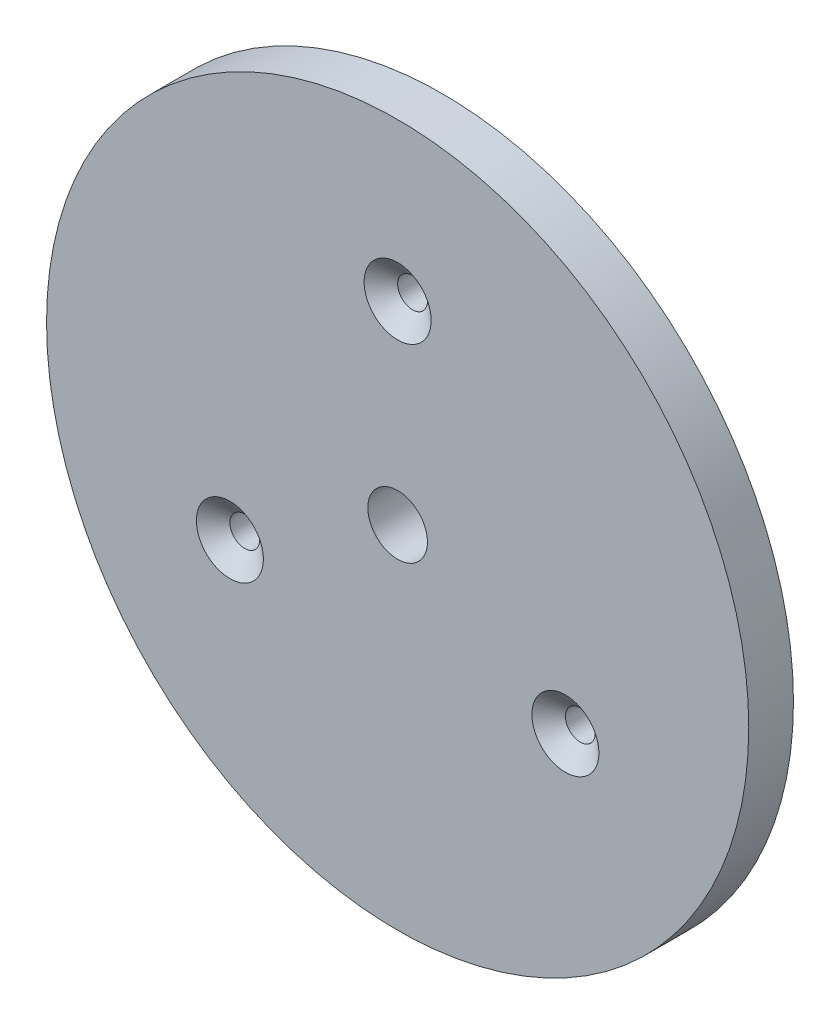
ISO-10303-21;
HEADER;
FILE_DESCRIPTION(('STEP AP214'),'2;1');
FILE_NAME('part.step','',(''),(''),'','','');
FILE_SCHEMA(('AUTOMOTIVE_DESIGN { 1 0 10303 214 1 1 1 1 }'));
ENDSEC;
DATA;
#1=APPLICATION_CONTEXT('core data for automotive mechanical design processes');
#2=APPLICATION_PROTOCOL_DEFINITION('international standard','automotive_design',2000,#1);
#3=PRODUCT_CONTEXT('',#1,'mechanical');
#4=PRODUCT('Part','Part','',(#3));
#5=PRODUCT_RELATED_PRODUCT_CATEGORY('part','',(#4));
#6=PRODUCT_DEFINITION_FORMATION('','',#4);
#7=PRODUCT_DEFINITION_CONTEXT('part definition',#1,'design');
#8=PRODUCT_DEFINITION('design','',#6,#7);
#9=PRODUCT_DEFINITION_SHAPE('','',#8);
#10=(LENGTH_UNIT() NAMED_UNIT(*) SI_UNIT(.MILLI.,.METRE.));
#11=(NAMED_UNIT(*) PLANE_ANGLE_UNIT() SI_UNIT($,.RADIAN.));
#12=(NAMED_UNIT(*) SI_UNIT($,.STERADIAN.) SOLID_ANGLE_UNIT());
#13=UNCERTAINTY_MEASURE_WITH_UNIT(LENGTH_MEASURE(1.E-05),#10,'distance_accuracy_value','');
#14=(GEOMETRIC_REPRESENTATION_CONTEXT(3) GLOBAL_UNCERTAINTY_ASSIGNED_CONTEXT((#13)) GLOBAL_UNIT_ASSIGNED_CONTEXT((#10,
#11,#12)) REPRESENTATION_CONTEXT('',''));
#15=CARTESIAN_POINT('',(0.,0.,0.));
#16=DIRECTION('',(0.,0.,1.));
#17=DIRECTION('',(1.,0.,0.));
#18=AXIS2_PLACEMENT_3D('',#15,#16,#17);
#19=CARTESIAN_POINT('',(0.,0.,6.));
#20=DIRECTION('',(0.,0.,1.));
#21=DIRECTION('',(1.,0.,0.));
#22=AXIS2_PLACEMENT_3D('',#19,#20,#21);
#23=PLANE('',#22);
#24=CARTESIAN_POINT('',(22.5166604983954,-13.,6.));
#25=DIRECTION('',(0.,0.,1.));
#26=DIRECTION('',(1.,0.,0.));
#27=AXIS2_PLACEMENT_3D('',#24,#25,#26);
#28=CIRCLE('',#27,4.5);
#29=CARTESIAN_POINT('',(27.0166604983954,-13.,6.));
#30=VERTEX_POINT('',#29);
#31=EDGE_CURVE('E52',#30,#30,#28,.F.);
#32=ORIENTED_EDGE('',*,*,#31,.T.);
#33=EDGE_LOOP('',(#32));
#34=FACE_BOUND('',#33,.T.);
#35=CARTESIAN_POINT('',(0.,26.,6.));
#36=DIRECTION('',(0.,0.,1.));
#37=DIRECTION('',(1.,0.,0.));
#38=AXIS2_PLACEMENT_3D('',#35,#36,#37);
#39=CIRCLE('',#38,4.50000000000003);
#40=CARTESIAN_POINT('',(4.50000000000003,26.,6.));
#41=VERTEX_POINT('',#40);
#42=EDGE_CURVE('E56',#41,#41,#39,.F.);
#43=ORIENTED_EDGE('',*,*,#42,.T.);
#44=EDGE_LOOP('',(#43));
#45=FACE_BOUND('',#44,.T.);
#46=CARTESIAN_POINT('',(-22.5166604983954,-13.,6.));
#47=DIRECTION('',(0.,0.,1.));
#48=DIRECTION('',(1.,0.,0.));
#49=AXIS2_PLACEMENT_3D('',#46,#47,#48);
#50=CIRCLE('',#49,4.50000000000005);
#51=CARTESIAN_POINT('',(-18.0166604983954,-13.,6.));
#52=VERTEX_POINT('',#51);
#53=EDGE_CURVE('E61',#52,#52,#50,.F.);
#54=ORIENTED_EDGE('',*,*,#53,.T.);
#55=EDGE_LOOP('',(#54));
#56=FACE_BOUND('',#55,.T.);
#57=CARTESIAN_POINT('',(0.,0.,6.));
#58=DIRECTION('',(0.,0.,1.));
#59=DIRECTION('',(1.,0.,0.));
#60=AXIS2_PLACEMENT_3D('',#57,#58,#59);
#61=CIRCLE('',#60,4.);
#62=CARTESIAN_POINT('',(4.,0.,6.));
#63=VERTEX_POINT('',#62);
#64=EDGE_CURVE('E71',#63,#63,#61,.T.);
#65=ORIENTED_EDGE('',*,*,#64,.F.);
#66=EDGE_LOOP('',(#65));
#67=FACE_BOUND('',#66,.T.);
#68=CARTESIAN_POINT('',(0.,0.,6.));
#69=DIRECTION('',(0.,0.,1.));
#70=DIRECTION('',(1.,0.,0.));
#71=AXIS2_PLACEMENT_3D('',#68,#69,#70);
#72=CIRCLE('',#71,47.125);
#73=CARTESIAN_POINT('',(47.125,0.,6.));
#74=VERTEX_POINT('',#73);
#75=EDGE_CURVE('E67',#74,#74,#72,.T.);
#76=ORIENTED_EDGE('',*,*,#75,.T.);
#77=EDGE_LOOP('',(#76));
#78=FACE_BOUND('',#77,.T.);
#79=ADVANCED_FACE('F40',(#34,#45,#56,#67,#78),#23,.T.);
#80=CARTESIAN_POINT('',(0.,0.,0.));
#81=DIRECTION('',(0.,0.,1.));
#82=DIRECTION('',(1.,0.,0.));
#83=AXIS2_PLACEMENT_3D('',#80,#81,#82);
#84=PLANE('',#83);
#85=CARTESIAN_POINT('',(0.,0.,0.));
#86=DIRECTION('',(0.,0.,1.));
#87=DIRECTION('',(1.,0.,0.));
#88=AXIS2_PLACEMENT_3D('',#85,#86,#87);
#89=CIRCLE('',#88,47.125);
#90=CARTESIAN_POINT('',(47.125,0.,0.));
#91=VERTEX_POINT('',#90);
#92=EDGE_CURVE('E68',#91,#91,#89,.T.);
#93=ORIENTED_EDGE('',*,*,#92,.F.);
#94=EDGE_LOOP('',(#93));
#95=FACE_BOUND('',#94,.T.);
#96=CARTESIAN_POINT('',(0.,0.,0.));
#97=DIRECTION('',(0.,0.,1.));
#98=DIRECTION('',(1.,0.,0.));
#99=AXIS2_PLACEMENT_3D('',#96,#97,#98);
#100=CIRCLE('',#99,4.);
#101=CARTESIAN_POINT('',(4.,0.,0.));
#102=VERTEX_POINT('',#101);
#103=EDGE_CURVE('E74',#102,#102,#100,.T.);
#104=ORIENTED_EDGE('',*,*,#103,.T.);
#105=EDGE_LOOP('',(#104));
#106=FACE_BOUND('',#105,.T.);
#107=CARTESIAN_POINT('',(0.,26.,0.));
#108=DIRECTION('',(0.,0.,1.));
#109=DIRECTION('',(1.,0.,0.));
#110=AXIS2_PLACEMENT_3D('',#107,#108,#109);
#111=CIRCLE('',#110,2.);
#112=CARTESIAN_POINT('',(2.,26.,0.));
#113=VERTEX_POINT('',#112);
#114=EDGE_CURVE('E77',#113,#113,#111,.T.);
#115=ORIENTED_EDGE('',*,*,#114,.T.);
#116=EDGE_LOOP('',(#115));
#117=FACE_BOUND('',#116,.T.);
#118=CARTESIAN_POINT('',(22.5166604983954,-13.,0.));
#119=DIRECTION('',(0.,0.,1.));
#120=DIRECTION('',(1.,0.,0.));
#121=AXIS2_PLACEMENT_3D('',#118,#119,#120);
#122=CIRCLE('',#121,2.);
#123=CARTESIAN_POINT('',(24.5166604983954,-13.,0.));
#124=VERTEX_POINT('',#123);
#125=EDGE_CURVE('E82',#124,#124,#122,.T.);
#126=ORIENTED_EDGE('',*,*,#125,.T.);
#127=EDGE_LOOP('',(#126));
#128=FACE_BOUND('',#127,.T.);
#129=CARTESIAN_POINT('',(-22.5166604983954,-13.,0.));
#130=DIRECTION('',(0.,0.,1.));
#131=DIRECTION('',(1.,0.,0.));
#132=AXIS2_PLACEMENT_3D('',#129,#130,#131);
#133=CIRCLE('',#132,2.);
#134=CARTESIAN_POINT('',(-20.5166604983954,-13.,0.));
#135=VERTEX_POINT('',#134);
#136=EDGE_CURVE('E85',#135,#135,#133,.T.);
#137=ORIENTED_EDGE('',*,*,#136,.T.);
#138=EDGE_LOOP('',(#137));
#139=FACE_BOUND('',#138,.T.);
#140=ADVANCED_FACE('F89',(#95,#106,#117,#128,#139),#84,.F.);
#141=CARTESIAN_POINT('',(0.,0.,6.));
#142=DIRECTION('',(0.,0.,-1.));
#143=DIRECTION('',(-1.,0.,0.));
#144=AXIS2_PLACEMENT_3D('',#141,#142,#143);
#145=CYLINDRICAL_SURFACE('',#144,47.125);
#146=ORIENTED_EDGE('',*,*,#75,.F.);
#147=EDGE_LOOP('',(#146));
#148=FACE_BOUND('',#147,.T.);
#149=ORIENTED_EDGE('',*,*,#92,.T.);
#150=EDGE_LOOP('',(#149));
#151=FACE_BOUND('',#150,.T.);
#152=ADVANCED_FACE('F114',(#148,#151),#145,.T.);
#153=CARTESIAN_POINT('',(0.,0.,6.));
#154=DIRECTION('',(0.,0.,-1.));
#155=DIRECTION('',(-1.,0.,0.));
#156=AXIS2_PLACEMENT_3D('',#153,#154,#155);
#157=CYLINDRICAL_SURFACE('',#156,4.);
#158=ORIENTED_EDGE('',*,*,#64,.T.);
#159=EDGE_LOOP('',(#158));
#160=FACE_BOUND('',#159,.T.);
#161=ORIENTED_EDGE('',*,*,#103,.F.);
#162=EDGE_LOOP('',(#161));
#163=FACE_BOUND('',#162,.T.);
#164=ADVANCED_FACE('F119',(#160,#163),#157,.F.);
#165=CARTESIAN_POINT('',(0.,26.,6.));
#166=DIRECTION('',(0.,0.,-1.));
#167=DIRECTION('',(-1.,0.,0.));
#168=AXIS2_PLACEMENT_3D('',#165,#166,#167);
#169=CYLINDRICAL_SURFACE('',#168,2.);
#170=CARTESIAN_POINT('',(0.,26.,3.99999999999998));
#171=DIRECTION('',(0.,0.,1.));
#172=DIRECTION('',(1.,0.,0.));
#173=AXIS2_PLACEMENT_3D('',#170,#171,#172);
#174=CIRCLE('',#173,2.);
#175=CARTESIAN_POINT('',(2.,26.,3.99999999999998));
#176=VERTEX_POINT('',#175);
#177=EDGE_CURVE('E48',#176,#176,#174,.T.);
#178=ORIENTED_EDGE('',*,*,#177,.T.);
#179=EDGE_LOOP('',(#178));
#180=FACE_BOUND('',#179,.T.);
#181=ORIENTED_EDGE('',*,*,#114,.F.);
#182=EDGE_LOOP('',(#181));
#183=FACE_BOUND('',#182,.T.);
#184=ADVANCED_FACE('F103',(#180,#183),#169,.F.);
#185=CARTESIAN_POINT('',(22.5166604983954,-13.,6.));
#186=DIRECTION('',(0.,0.,-1.));
#187=DIRECTION('',(-1.,0.,0.));
#188=AXIS2_PLACEMENT_3D('',#185,#186,#187);
#189=CYLINDRICAL_SURFACE('',#188,2.);
#190=CARTESIAN_POINT('',(22.5166604983954,-13.,3.99999999999999));
#191=DIRECTION('',(0.,0.,1.));
#192=DIRECTION('',(1.,0.,0.));
#193=AXIS2_PLACEMENT_3D('',#190,#191,#192);
#194=CIRCLE('',#193,2.);
#195=CARTESIAN_POINT('',(24.5166604983954,-13.,3.99999999999999));
#196=VERTEX_POINT('',#195);
#197=EDGE_CURVE('E64',#196,#196,#194,.T.);
#198=ORIENTED_EDGE('',*,*,#197,.T.);
#199=EDGE_LOOP('',(#198));
#200=FACE_BOUND('',#199,.T.);
#201=ORIENTED_EDGE('',*,*,#125,.F.);
#202=EDGE_LOOP('',(#201));
#203=FACE_BOUND('',#202,.T.);
#204=ADVANCED_FACE('F94',(#200,#203),#189,.F.);
#205=CARTESIAN_POINT('',(-22.5166604983954,-13.,6.));
#206=DIRECTION('',(0.,0.,-1.));
#207=DIRECTION('',(-1.,0.,0.));
#208=AXIS2_PLACEMENT_3D('',#205,#206,#207);
#209=CYLINDRICAL_SURFACE('',#208,2.);
#210=CARTESIAN_POINT('',(-22.5166604983954,-13.,3.99999999999997));
#211=DIRECTION('',(0.,0.,1.));
#212=DIRECTION('',(1.,0.,0.));
#213=AXIS2_PLACEMENT_3D('',#210,#211,#212);
#214=CIRCLE('',#213,2.);
#215=CARTESIAN_POINT('',(-20.5166604983954,-13.,3.99999999999997));
#216=VERTEX_POINT('',#215);
#217=EDGE_CURVE('E10',#216,#216,#214,.T.);
#218=ORIENTED_EDGE('',*,*,#217,.T.);
#219=EDGE_LOOP('',(#218));
#220=FACE_BOUND('',#219,.T.);
#221=ORIENTED_EDGE('',*,*,#136,.F.);
#222=EDGE_LOOP('',(#221));
#223=FACE_BOUND('',#222,.T.);
#224=ADVANCED_FACE('F91',(#220,#223),#209,.F.);
#225=CARTESIAN_POINT('',(22.5166604983954,-13.,3.99999999999999));
#226=DIRECTION('',(0.,0.,1.));
#227=DIRECTION('',(1.,0.,0.));
#228=AXIS2_PLACEMENT_3D('',#225,#226,#227);
#229=CONICAL_SURFACE('',#228,2.,0.896055384571343);
#230=ORIENTED_EDGE('',*,*,#31,.F.);
#231=EDGE_LOOP('',(#230));
#232=FACE_BOUND('',#231,.T.);
#233=ORIENTED_EDGE('',*,*,#197,.F.);
#234=EDGE_LOOP('',(#233));
#235=FACE_BOUND('',#234,.T.);
#236=ADVANCED_FACE('F93',(#232,#235),#229,.F.);
#237=CARTESIAN_POINT('',(0.,26.,3.99999999999998));
#238=DIRECTION('',(0.,0.,1.));
#239=DIRECTION('',(1.,0.,0.));
#240=AXIS2_PLACEMENT_3D('',#237,#238,#239);
#241=CONICAL_SURFACE('',#240,2.,0.896055384571345);
#242=ORIENTED_EDGE('',*,*,#42,.F.);
#243=EDGE_LOOP('',(#242));
#244=FACE_BOUND('',#243,.T.);
#245=ORIENTED_EDGE('',*,*,#177,.F.);
#246=EDGE_LOOP('',(#245));
#247=FACE_BOUND('',#246,.T.);
#248=ADVANCED_FACE('F100',(#244,#247),#241,.F.);
#249=CARTESIAN_POINT('',(-22.5166604983954,-13.,3.99999999999997));
#250=DIRECTION('',(0.,0.,1.));
#251=DIRECTION('',(1.,0.,0.));
#252=AXIS2_PLACEMENT_3D('',#249,#250,#251);
#253=CONICAL_SURFACE('',#252,2.,0.896055384571344);
#254=ORIENTED_EDGE('',*,*,#53,.F.);
#255=EDGE_LOOP('',(#254));
#256=FACE_BOUND('',#255,.T.);
#257=ORIENTED_EDGE('',*,*,#217,.F.);
#258=EDGE_LOOP('',(#257));
#259=FACE_BOUND('',#258,.T.);
#260=ADVANCED_FACE('F43',(#256,#259),#253,.F.);
#261=CLOSED_SHELL('',(#79,#140,#152,#164,#184,#204,#224,#236,#248,#260));
#262=MANIFOLD_SOLID_BREP('B2',#261);
#263=ADVANCED_BREP_SHAPE_REPRESENTATION('',(#18,#262),#14);
#264=SHAPE_DEFINITION_REPRESENTATION(#9,#263);
ENDSEC;
END-ISO-10303-21;
